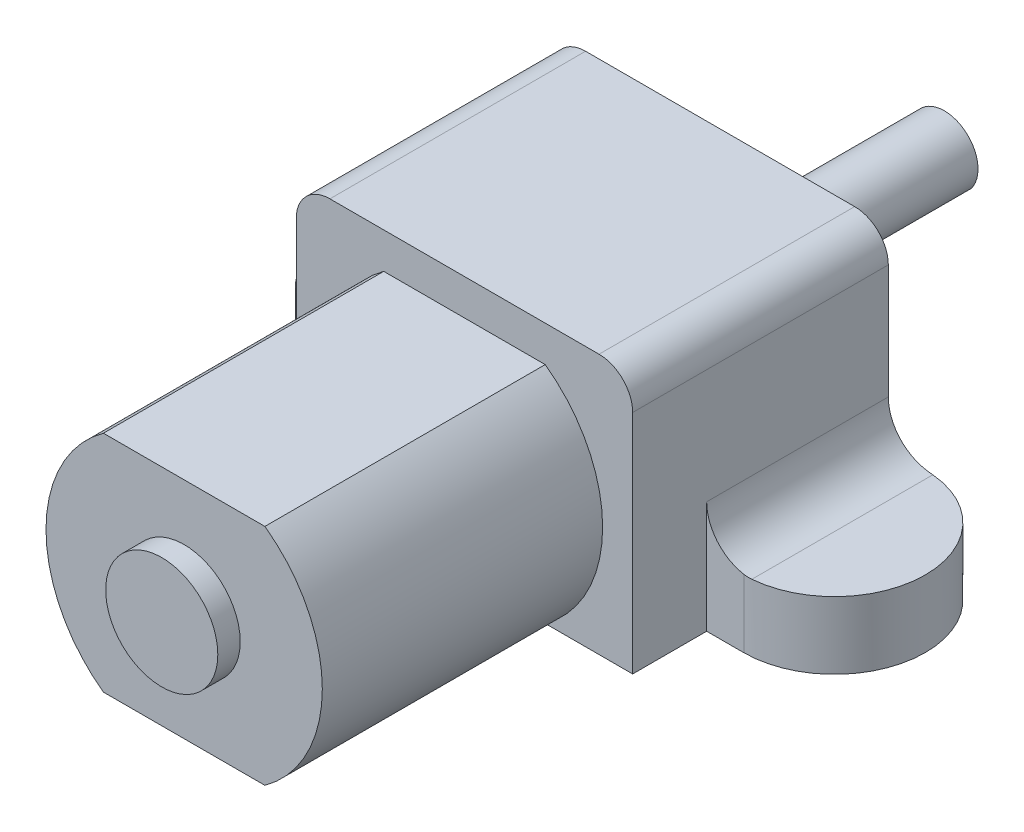
ISO-10303-21;
HEADER;
FILE_DESCRIPTION(('STEP AP214'),'2;1');
FILE_NAME('part.step','',(''),(''),'','','');
FILE_SCHEMA(('AUTOMOTIVE_DESIGN { 1 0 10303 214 1 1 1 1 }'));
ENDSEC;
DATA;
#1=APPLICATION_CONTEXT('core data for automotive mechanical design processes');
#2=APPLICATION_PROTOCOL_DEFINITION('international standard','automotive_design',2000,#1);
#3=PRODUCT_CONTEXT('',#1,'mechanical');
#4=PRODUCT('Part','Part','',(#3));
#5=PRODUCT_RELATED_PRODUCT_CATEGORY('part','',(#4));
#6=PRODUCT_DEFINITION_FORMATION('','',#4);
#7=PRODUCT_DEFINITION_CONTEXT('part definition',#1,'design');
#8=PRODUCT_DEFINITION('design','',#6,#7);
#9=PRODUCT_DEFINITION_SHAPE('','',#8);
#10=(LENGTH_UNIT() NAMED_UNIT(*) SI_UNIT(.MILLI.,.METRE.));
#11=(NAMED_UNIT(*) PLANE_ANGLE_UNIT() SI_UNIT($,.RADIAN.));
#12=(NAMED_UNIT(*) SI_UNIT($,.STERADIAN.) SOLID_ANGLE_UNIT());
#13=UNCERTAINTY_MEASURE_WITH_UNIT(LENGTH_MEASURE(1.E-05),#10,'distance_accuracy_value','');
#14=(GEOMETRIC_REPRESENTATION_CONTEXT(3) GLOBAL_UNCERTAINTY_ASSIGNED_CONTEXT((#13)) GLOBAL_UNIT_ASSIGNED_CONTEXT((#10,
#11,#12)) REPRESENTATION_CONTEXT('',''));
#15=CARTESIAN_POINT('',(0.,0.,0.));
#16=DIRECTION('',(0.,0.,1.));
#17=DIRECTION('',(1.,0.,0.));
#18=AXIS2_PLACEMENT_3D('',#15,#16,#17);
#19=CARTESIAN_POINT('',(0.,-0.800465861795815,23.9));
#20=DIRECTION('',(0.,0.,1.));
#21=DIRECTION('',(1.,0.,0.));
#22=AXIS2_PLACEMENT_3D('',#19,#20,#21);
#23=PLANE('',#22);
#24=CARTESIAN_POINT('',(0.,-0.800465861795815,23.9));
#25=DIRECTION('',(0.,0.,1.));
#26=DIRECTION('',(1.,0.,0.));
#27=AXIS2_PLACEMENT_3D('',#24,#25,#26);
#28=CIRCLE('',#27,6.16079066346756);
#29=CARTESIAN_POINT('',(3.6,-5.8,23.9));
#30=VERTEX_POINT('',#29);
#31=CARTESIAN_POINT('',(3.6,4.19906827640837,23.9));
#32=VERTEX_POINT('',#31);
#33=EDGE_CURVE('E399',#30,#32,#28,.T.);
#34=ORIENTED_EDGE('',*,*,#33,.T.);
#35=DIRECTION('',(-1.,0.,0.));
#36=VECTOR('',#35,1.);
#37=CARTESIAN_POINT('',(-3.6,4.19906827640837,23.9));
#38=LINE('',#37,#36);
#39=CARTESIAN_POINT('',(-3.6,4.19906827640837,23.9));
#40=VERTEX_POINT('',#39);
#41=EDGE_CURVE('E402',#32,#40,#38,.T.);
#42=ORIENTED_EDGE('',*,*,#41,.T.);
#43=CARTESIAN_POINT('',(0.,-0.800465861795815,23.9));
#44=DIRECTION('',(0.,0.,1.));
#45=DIRECTION('',(1.,0.,0.));
#46=AXIS2_PLACEMENT_3D('',#43,#44,#45);
#47=CIRCLE('',#46,6.16079066346756);
#48=CARTESIAN_POINT('',(-3.6,-5.8,23.9));
#49=VERTEX_POINT('',#48);
#50=EDGE_CURVE('E405',#40,#49,#47,.T.);
#51=ORIENTED_EDGE('',*,*,#50,.T.);
#52=DIRECTION('',(1.,0.,0.));
#53=VECTOR('',#52,1.);
#54=CARTESIAN_POINT('',(-3.6,-5.8,23.9));
#55=LINE('',#54,#53);
#56=EDGE_CURVE('E407',#49,#30,#55,.T.);
#57=ORIENTED_EDGE('',*,*,#56,.T.);
#58=EDGE_LOOP('',(#34,#42,#51,#57));
#59=FACE_BOUND('',#58,.T.);
#60=CARTESIAN_POINT('',(0.,-0.800465861795815,23.9));
#61=DIRECTION('',(0.,0.,1.));
#62=DIRECTION('',(1.,0.,0.));
#63=AXIS2_PLACEMENT_3D('',#60,#61,#62);
#64=CIRCLE('',#63,2.5);
#65=CARTESIAN_POINT('',(2.5,-0.800465861795815,23.9));
#66=VERTEX_POINT('',#65);
#67=EDGE_CURVE('E452',#66,#66,#64,.T.);
#68=ORIENTED_EDGE('',*,*,#67,.F.);
#69=EDGE_LOOP('',(#68));
#70=FACE_BOUND('',#69,.T.);
#71=ADVANCED_FACE('F36',(#59,#70),#23,.T.);
#72=CARTESIAN_POINT('',(9.5,-0.799999999999999,8.1));
#73=DIRECTION('',(0.,0.,-1.));
#74=DIRECTION('',(0.,1.,0.));
#75=AXIS2_PLACEMENT_3D('',#72,#73,#74);
#76=CYLINDRICAL_SURFACE('',#75,2.);
#77=CARTESIAN_POINT('',(9.5,-2.8,0.0150974913643064));
#78=CARTESIAN_POINT('',(9.44815312771048,-2.80000824449643,0.0105907373298993));
#79=CARTESIAN_POINT('',(9.39621865764928,-2.79798395132537,0.00710049425139584));
#80=CARTESIAN_POINT('',(9.29295128964275,-2.78992088042198,0.00214096238895021));
#81=CARTESIAN_POINT('',(9.2416167789262,-2.78391179682455,0.000656970002410962));
#82=CARTESIAN_POINT('',(9.13955148697663,-2.76792920261616,-0.000367540570609882));
#83=CARTESIAN_POINT('',(9.08882069263783,-2.75795577822741,9.18989764465253E-05));
#84=CARTESIAN_POINT('',(8.98795499809073,-2.73404333928579,0.00286277611937516));
#85=CARTESIAN_POINT('',(8.93782731834473,-2.72007543253437,0.00518793827901116));
#86=CARTESIAN_POINT('',(8.88837861318026,-2.70418467570367,0.00839574563265417));
#87=B_SPLINE_CURVE_WITH_KNOTS('',3,(#77,#78,#79,#80,#81,#82,#83,#84,#85,#86),.UNSPECIFIED.,.F.,
.F.,(4,2,2,2,4),(0.,0.156076682454964,0.31100317892682,0.465926306018408,0.621999637199964),.UNSPECIFIED.);
#88=CARTESIAN_POINT('',(9.17184315486788,-2.77289459551009,0.));
#89=VERTEX_POINT('',#88);
#90=CARTESIAN_POINT('',(9.5,-2.8,0.0150974913643064));
#91=VERTEX_POINT('',#90);
#92=EDGE_CURVE('E494',#89,#91,#87,.F.);
#93=ORIENTED_EDGE('',*,*,#92,.F.);
#94=CARTESIAN_POINT('',(9.5,-0.799999999999998,0.));
#95=DIRECTION('',(0.,0.,-1.));
#96=DIRECTION('',(-1.,0.,0.));
#97=AXIS2_PLACEMENT_3D('',#94,#95,#96);
#98=CIRCLE('',#97,2.);
#99=CARTESIAN_POINT('',(7.5,-0.799999999999998,0.));
#100=VERTEX_POINT('',#99);
#101=EDGE_CURVE('E45',#89,#100,#98,.T.);
#102=ORIENTED_EDGE('',*,*,#101,.T.);
#103=DIRECTION('',(0.,0.,1.));
#104=VECTOR('',#103,1.);
#105=CARTESIAN_POINT('',(7.5,-0.799999999999999,8.1));
#106=LINE('',#105,#104);
#107=CARTESIAN_POINT('',(7.5,-0.799999999999999,8.1));
#108=VERTEX_POINT('',#107);
#109=EDGE_CURVE('E489',#108,#100,#106,.F.);
#110=ORIENTED_EDGE('',*,*,#109,.F.);
#111=CARTESIAN_POINT('',(9.5,-0.799999999999999,8.1));
#112=DIRECTION('',(0.,0.,-1.));
#113=DIRECTION('',(-1.,0.,0.));
#114=AXIS2_PLACEMENT_3D('',#111,#112,#113);
#115=CIRCLE('',#114,2.);
#116=CARTESIAN_POINT('',(9.17184315486815,-2.77289459551014,8.1));
#117=VERTEX_POINT('',#116);
#118=EDGE_CURVE('E12',#108,#117,#115,.F.);
#119=ORIENTED_EDGE('',*,*,#118,.T.);
#120=CARTESIAN_POINT('',(9.5,-2.8,8.08490250863569));
#121=CARTESIAN_POINT('',(9.44815312771048,-2.80000824449643,8.0894092626701));
#122=CARTESIAN_POINT('',(9.39621865764928,-2.79798395132537,8.0928995057486));
#123=CARTESIAN_POINT('',(9.29295128964275,-2.78992088042198,8.09785903761105));
#124=CARTESIAN_POINT('',(9.2416167789262,-2.78391179682455,8.09934302999759));
#125=CARTESIAN_POINT('',(9.13955148697663,-2.76792920261617,8.10036754057061));
#126=CARTESIAN_POINT('',(9.08882069263783,-2.75795577822741,8.09990810102355));
#127=CARTESIAN_POINT('',(8.98795499809073,-2.73404333928579,8.09713722388063));
#128=CARTESIAN_POINT('',(8.93782731834473,-2.72007543253437,8.09481206172099));
#129=CARTESIAN_POINT('',(8.88837861318026,-2.70418467570367,8.09160425436735));
#130=B_SPLINE_CURVE_WITH_KNOTS('',3,(#120,#121,#122,#123,#124,#125,#126,#127,#128,#129),
.UNSPECIFIED.,.F.,.F.,(4,2,2,2,4),(0.,0.156076682454964,0.31100317892682,0.465926306018408,
0.621999637199965),.UNSPECIFIED.);
#131=CARTESIAN_POINT('',(9.5,-2.8,8.08490250863569));
#132=VERTEX_POINT('',#131);
#133=EDGE_CURVE('E500',#132,#117,#130,.T.);
#134=ORIENTED_EDGE('',*,*,#133,.F.);
#135=DIRECTION('',(0.,0.,1.));
#136=VECTOR('',#135,1.);
#137=CARTESIAN_POINT('',(9.5,-2.8,8.1));
#138=LINE('',#137,#136);
#139=EDGE_CURVE('E486',#91,#132,#138,.T.);
#140=ORIENTED_EDGE('',*,*,#139,.F.);
#141=EDGE_LOOP('',(#93,#102,#110,#119,#134,#140));
#142=FACE_BOUND('',#141,.T.);
#143=ADVANCED_FACE('F38',(#142),#76,.F.);
#144=CARTESIAN_POINT('',(-7.5,-5.8,11.4));
#145=DIRECTION('',(0.,1.,0.));
#146=DIRECTION('',(0.,0.,1.));
#147=AXIS2_PLACEMENT_3D('',#144,#145,#146);
#148=PLANE('',#147);
#149=DIRECTION('',(1.,0.,0.));
#150=VECTOR('',#149,1.);
#151=CARTESIAN_POINT('',(-7.5,-5.8,0.));
#152=LINE('',#151,#150);
#153=CARTESIAN_POINT('',(-9.14356009032005,-5.8,0.));
#154=VERTEX_POINT('',#153);
#155=CARTESIAN_POINT('',(9.17184315486785,-5.8,0.));
#156=VERTEX_POINT('',#155);
#157=EDGE_CURVE('E194',#154,#156,#152,.T.);
#158=ORIENTED_EDGE('',*,*,#157,.T.);
#159=CARTESIAN_POINT('',(9.14994077646019,-5.8,4.05));
#160=DIRECTION('',(0.,1.,0.));
#161=DIRECTION('',(0.,0.,1.));
#162=AXIS2_PLACEMENT_3D('',#159,#160,#161);
#163=CIRCLE('',#162,4.05005922353981);
#164=CARTESIAN_POINT('',(9.17184315486829,-5.8,8.1));
#165=VERTEX_POINT('',#164);
#166=EDGE_CURVE('E184',#156,#165,#163,.F.);
#167=ORIENTED_EDGE('',*,*,#166,.T.);
#168=DIRECTION('',(-1.,0.,0.));
#169=VECTOR('',#168,1.);
#170=CARTESIAN_POINT('',(13.2,-5.8,8.1));
#171=LINE('',#170,#169);
#172=CARTESIAN_POINT('',(7.5,-5.8,8.1));
#173=VERTEX_POINT('',#172);
#174=EDGE_CURVE('E463',#165,#173,#171,.T.);
#175=ORIENTED_EDGE('',*,*,#174,.T.);
#176=DIRECTION('',(0.,0.,-1.));
#177=VECTOR('',#176,1.);
#178=CARTESIAN_POINT('',(7.5,-5.8,11.4));
#179=LINE('',#178,#177);
#180=CARTESIAN_POINT('',(7.5,-5.8,11.4));
#181=VERTEX_POINT('',#180);
#182=EDGE_CURVE('E215',#181,#173,#179,.T.);
#183=ORIENTED_EDGE('',*,*,#182,.F.);
#184=DIRECTION('',(1.,0.,0.));
#185=VECTOR('',#184,1.);
#186=CARTESIAN_POINT('',(-7.5,-5.8,11.4));
#187=LINE('',#186,#185);
#188=CARTESIAN_POINT('',(3.6,-5.8,11.4));
#189=VERTEX_POINT('',#188);
#190=EDGE_CURVE('E225',#189,#181,#187,.T.);
#191=ORIENTED_EDGE('',*,*,#190,.F.);
#192=DIRECTION('',(0.,0.,-1.));
#193=VECTOR('',#192,1.);
#194=CARTESIAN_POINT('',(3.6,-5.8,23.9));
#195=LINE('',#194,#193);
#196=EDGE_CURVE('E409',#30,#189,#195,.T.);
#197=ORIENTED_EDGE('',*,*,#196,.F.);
#198=ORIENTED_EDGE('',*,*,#56,.F.);
#199=DIRECTION('',(0.,0.,-1.));
#200=VECTOR('',#199,1.);
#201=CARTESIAN_POINT('',(-3.6,-5.8,23.9));
#202=LINE('',#201,#200);
#203=CARTESIAN_POINT('',(-3.6,-5.8,11.4));
#204=VERTEX_POINT('',#203);
#205=EDGE_CURVE('E423',#49,#204,#202,.T.);
#206=ORIENTED_EDGE('',*,*,#205,.T.);
#207=CARTESIAN_POINT('',(-7.5,-5.8,11.4));
#208=VERTEX_POINT('',#207);
#209=EDGE_CURVE('E219',#208,#204,#187,.T.);
#210=ORIENTED_EDGE('',*,*,#209,.F.);
#211=DIRECTION('',(0.,0.,-1.));
#212=VECTOR('',#211,1.);
#213=CARTESIAN_POINT('',(-7.5,-5.8,11.4));
#214=LINE('',#213,#212);
#215=CARTESIAN_POINT('',(-7.5,-5.8,8.1));
#216=VERTEX_POINT('',#215);
#217=EDGE_CURVE('E218',#208,#216,#214,.T.);
#218=ORIENTED_EDGE('',*,*,#217,.T.);
#219=DIRECTION('',(1.,0.,0.));
#220=VECTOR('',#219,1.);
#221=CARTESIAN_POINT('',(-13.2,-5.8,8.1));
#222=LINE('',#221,#220);
#223=CARTESIAN_POINT('',(-9.46668465095968,-5.8,8.1));
#224=VERTEX_POINT('',#223);
#225=EDGE_CURVE('E376',#224,#216,#222,.T.);
#226=ORIENTED_EDGE('',*,*,#225,.F.);
#227=CARTESIAN_POINT('',(-9.14356009032005,-5.8,4.05644502973386));
#228=DIRECTION('',(0.,1.,0.));
#229=DIRECTION('',(0.,0.,1.));
#230=AXIS2_PLACEMENT_3D('',#227,#228,#229);
#231=CIRCLE('',#230,4.05644502973386);
#232=CARTESIAN_POINT('',(-13.2,-5.8,4.05644502973386));
#233=VERTEX_POINT('',#232);
#234=EDGE_CURVE('E373',#233,#224,#231,.T.);
#235=ORIENTED_EDGE('',*,*,#234,.F.);
#236=DIRECTION('',(0.,0.,1.));
#237=VECTOR('',#236,1.);
#238=CARTESIAN_POINT('',(-13.2,-5.8,8.1));
#239=LINE('',#238,#237);
#240=CARTESIAN_POINT('',(-13.2,-5.8,4.05));
#241=VERTEX_POINT('',#240);
#242=EDGE_CURVE('E364',#241,#233,#239,.T.);
#243=ORIENTED_EDGE('',*,*,#242,.F.);
#244=CARTESIAN_POINT('',(-9.14356009032005,-5.8,4.05644502973386));
#245=DIRECTION('',(0.,1.,0.));
#246=DIRECTION('',(0.,0.,1.));
#247=AXIS2_PLACEMENT_3D('',#244,#245,#246);
#248=CIRCLE('',#247,4.05644502973386);
#249=EDGE_CURVE('E203',#154,#241,#248,.T.);
#250=ORIENTED_EDGE('',*,*,#249,.F.);
#251=EDGE_LOOP('',(#158,#167,#175,#183,#191,#197,#198,#206,#210,#218,#226,#235,#243,#250));
#252=FACE_BOUND('',#251,.T.);
#253=ADVANCED_FACE('F201',(#252),#148,.F.);
#254=CARTESIAN_POINT('',(0.,0.,0.));
#255=DIRECTION('',(0.,0.,-1.));
#256=DIRECTION('',(-1.,0.,0.));
#257=AXIS2_PLACEMENT_3D('',#254,#255,#256);
#258=PLANE('',#257);
#259=DIRECTION('',(-1.,0.,0.));
#260=VECTOR('',#259,1.);
#261=CARTESIAN_POINT('',(1.2,-0.9,0.));
#262=LINE('',#261,#260);
#263=CARTESIAN_POINT('',(1.2,-0.9,0.));
#264=VERTEX_POINT('',#263);
#265=CARTESIAN_POINT('',(-1.2,-0.9,0.));
#266=VERTEX_POINT('',#265);
#267=EDGE_CURVE('E388',#264,#266,#262,.T.);
#268=ORIENTED_EDGE('',*,*,#267,.F.);
#269=CARTESIAN_POINT('',(0.,0.,0.));
#270=DIRECTION('',(0.,0.,-1.));
#271=DIRECTION('',(-1.,0.,0.));
#272=AXIS2_PLACEMENT_3D('',#269,#270,#271);
#273=CIRCLE('',#272,1.5);
#274=EDGE_CURVE('E383',#266,#264,#273,.T.);
#275=ORIENTED_EDGE('',*,*,#274,.F.);
#276=EDGE_LOOP('',(#268,#275));
#277=FACE_BOUND('',#276,.T.);
#278=ORIENTED_EDGE('',*,*,#101,.F.);
#279=DIRECTION('',(0.,1.,0.));
#280=VECTOR('',#279,1.);
#281=CARTESIAN_POINT('',(9.17184315486785,-8.5,0.));
#282=LINE('',#281,#280);
#283=EDGE_CURVE('E59',#156,#89,#282,.T.);
#284=ORIENTED_EDGE('',*,*,#283,.F.);
#285=ORIENTED_EDGE('',*,*,#157,.F.);
#286=DIRECTION('',(0.,1.,0.));
#287=VECTOR('',#286,1.);
#288=CARTESIAN_POINT('',(-9.14356009032005,-12.8,0.));
#289=LINE('',#288,#287);
#290=CARTESIAN_POINT('',(-9.14356009032005,-2.76798134919703,0.));
#291=VERTEX_POINT('',#290);
#292=EDGE_CURVE('E466',#154,#291,#289,.T.);
#293=ORIENTED_EDGE('',*,*,#292,.T.);
#294=CARTESIAN_POINT('',(-9.5,-0.799999999999999,0.));
#295=DIRECTION('',(0.,0.,-1.));
#296=DIRECTION('',(-1.,0.,0.));
#297=AXIS2_PLACEMENT_3D('',#294,#295,#296);
#298=CIRCLE('',#297,2.);
#299=CARTESIAN_POINT('',(-7.5,-0.799999999999999,0.));
#300=VERTEX_POINT('',#299);
#301=EDGE_CURVE('E481',#300,#291,#298,.T.);
#302=ORIENTED_EDGE('',*,*,#301,.F.);
#303=DIRECTION('',(0.,-1.,0.));
#304=VECTOR('',#303,1.);
#305=CARTESIAN_POINT('',(-7.5,-5.8,0.));
#306=LINE('',#305,#304);
#307=CARTESIAN_POINT('',(-7.5,4.3,0.));
#308=VERTEX_POINT('',#307);
#309=EDGE_CURVE('E205',#308,#300,#306,.T.);
#310=ORIENTED_EDGE('',*,*,#309,.F.);
#311=CARTESIAN_POINT('',(-6.,4.3,0.));
#312=DIRECTION('',(0.,0.,-1.));
#313=DIRECTION('',(-1.,0.,0.));
#314=AXIS2_PLACEMENT_3D('',#311,#312,#313);
#315=CIRCLE('',#314,1.5);
#316=CARTESIAN_POINT('',(-6.,5.8,0.));
#317=VERTEX_POINT('',#316);
#318=EDGE_CURVE('E251',#308,#317,#315,.T.);
#319=ORIENTED_EDGE('',*,*,#318,.T.);
#320=DIRECTION('',(-1.,0.,0.));
#321=VECTOR('',#320,1.);
#322=CARTESIAN_POINT('',(-7.5,5.8,0.));
#323=LINE('',#322,#321);
#324=CARTESIAN_POINT('',(6.,5.8,0.));
#325=VERTEX_POINT('',#324);
#326=EDGE_CURVE('E211',#325,#317,#323,.T.);
#327=ORIENTED_EDGE('',*,*,#326,.F.);
#328=CARTESIAN_POINT('',(6.,4.3,0.));
#329=DIRECTION('',(0.,0.,-1.));
#330=DIRECTION('',(-1.,0.,0.));
#331=AXIS2_PLACEMENT_3D('',#328,#329,#330);
#332=CIRCLE('',#331,1.5);
#333=CARTESIAN_POINT('',(7.5,4.3,0.));
#334=VERTEX_POINT('',#333);
#335=EDGE_CURVE('E248',#325,#334,#332,.T.);
#336=ORIENTED_EDGE('',*,*,#335,.T.);
#337=DIRECTION('',(0.,1.,0.));
#338=VECTOR('',#337,1.);
#339=CARTESIAN_POINT('',(7.5,-5.8,0.));
#340=LINE('',#339,#338);
#341=EDGE_CURVE('E232',#100,#334,#340,.T.);
#342=ORIENTED_EDGE('',*,*,#341,.F.);
#343=EDGE_LOOP('',(#278,#284,#285,#293,#302,#310,#319,#327,#336,#342));
#344=FACE_BOUND('',#343,.T.);
#345=ADVANCED_FACE('F193',(#277,#344),#258,.T.);
#346=CARTESIAN_POINT('',(13.2,-2.8,8.1));
#347=DIRECTION('',(0.,-1.,0.));
#348=DIRECTION('',(0.,0.,-1.));
#349=AXIS2_PLACEMENT_3D('',#346,#347,#348);
#350=PLANE('',#349);
#351=CARTESIAN_POINT('',(9.14994077646019,-2.8,4.05));
#352=DIRECTION('',(0.,1.,0.));
#353=DIRECTION('',(0.,0.,1.));
#354=AXIS2_PLACEMENT_3D('',#351,#352,#353);
#355=CIRCLE('',#354,4.05005922353981);
#356=EDGE_CURVE('E197',#91,#132,#355,.F.);
#357=ORIENTED_EDGE('',*,*,#356,.F.);
#358=ORIENTED_EDGE('',*,*,#139,.T.);
#359=EDGE_LOOP('',(#357,#358));
#360=FACE_BOUND('',#359,.T.);
#361=ADVANCED_FACE('F308',(#360),#350,.F.);
#362=CARTESIAN_POINT('',(7.5,-5.8,11.4));
#363=DIRECTION('',(-1.,0.,0.));
#364=DIRECTION('',(0.,0.,1.));
#365=AXIS2_PLACEMENT_3D('',#362,#363,#364);
#366=PLANE('',#365);
#367=DIRECTION('',(0.,-1.,0.));
#368=VECTOR('',#367,1.);
#369=CARTESIAN_POINT('',(7.5,-5.8,8.1));
#370=LINE('',#369,#368);
#371=EDGE_CURVE('E189',#108,#173,#370,.T.);
#372=ORIENTED_EDGE('',*,*,#371,.F.);
#373=ORIENTED_EDGE('',*,*,#109,.T.);
#374=ORIENTED_EDGE('',*,*,#341,.T.);
#375=DIRECTION('',(0.,0.,1.));
#376=VECTOR('',#375,1.);
#377=CARTESIAN_POINT('',(7.5,4.3,11.4));
#378=LINE('',#377,#376);
#379=CARTESIAN_POINT('',(7.5,4.3,11.4));
#380=VERTEX_POINT('',#379);
#381=EDGE_CURVE('E222',#334,#380,#378,.T.);
#382=ORIENTED_EDGE('',*,*,#381,.T.);
#383=DIRECTION('',(0.,1.,0.));
#384=VECTOR('',#383,1.);
#385=CARTESIAN_POINT('',(7.5,-5.8,11.4));
#386=LINE('',#385,#384);
#387=EDGE_CURVE('E204',#181,#380,#386,.T.);
#388=ORIENTED_EDGE('',*,*,#387,.F.);
#389=ORIENTED_EDGE('',*,*,#182,.T.);
#390=EDGE_LOOP('',(#372,#373,#374,#382,#388,#389));
#391=FACE_BOUND('',#390,.T.);
#392=ADVANCED_FACE('F295',(#391),#366,.F.);
#393=CARTESIAN_POINT('',(-9.5,-0.799999999999999,0.));
#394=DIRECTION('',(0.,0.,1.));
#395=DIRECTION('',(1.,0.,0.));
#396=AXIS2_PLACEMENT_3D('',#393,#394,#395);
#397=CYLINDRICAL_SURFACE('',#396,2.);
#398=CARTESIAN_POINT('',(-9.5,-2.8,8.09719952240474));
#399=CARTESIAN_POINT('',(-9.44815856687958,-2.8000082334596,8.10178113958432));
#400=CARTESIAN_POINT('',(-9.39622814670322,-2.79798437227438,8.10534793646262));
#401=CARTESIAN_POINT('',(-9.29296579476972,-2.78992232953518,8.11046272065454));
#402=CARTESIAN_POINT('',(-9.24163227225051,-2.78391382885766,8.1120253857615));
#403=CARTESIAN_POINT('',(-9.13956593523447,-2.76793185911742,8.11320924490378));
#404=CARTESIAN_POINT('',(-9.08883310804294,-2.75795847400042,8.11283048004162));
#405=CARTESIAN_POINT('',(-8.98796073204633,-2.73404494869054,8.11022285214277));
#406=CARTESIAN_POINT('',(-8.9378283803315,-2.72007591917397,8.10798027976786));
#407=CARTESIAN_POINT('',(-8.88837373439782,-2.70418310863886,8.10485536009857));
#408=B_SPLINE_CURVE_WITH_KNOTS('',3,(#398,#399,#400,#401,#402,#403,#404,#405,#406,#407),
.UNSPECIFIED.,.F.,.F.,(4,2,2,2,4),(0.,0.156080174659477,0.311010601694024,0.465937748669463,
0.622014661972067),.UNSPECIFIED.);
#409=CARTESIAN_POINT('',(-9.46668465095967,-2.79972250262838,8.1));
#410=VERTEX_POINT('',#409);
#411=CARTESIAN_POINT('',(-9.5,-2.8,8.09719952240474));
#412=VERTEX_POINT('',#411);
#413=EDGE_CURVE('E275',#410,#412,#408,.F.);
#414=ORIENTED_EDGE('',*,*,#413,.F.);
#415=CARTESIAN_POINT('',(-9.5,-0.799999999999999,8.1));
#416=DIRECTION('',(0.,0.,-1.));
#417=DIRECTION('',(-1.,0.,0.));
#418=AXIS2_PLACEMENT_3D('',#415,#416,#417);
#419=CIRCLE('',#418,2.);
#420=CARTESIAN_POINT('',(-7.5,-0.799999999999999,8.1));
#421=VERTEX_POINT('',#420);
#422=EDGE_CURVE('E478',#410,#421,#419,.F.);
#423=ORIENTED_EDGE('',*,*,#422,.T.);
#424=DIRECTION('',(0.,0.,-1.));
#425=VECTOR('',#424,1.);
#426=CARTESIAN_POINT('',(-7.5,-0.799999999999999,0.));
#427=LINE('',#426,#425);
#428=EDGE_CURVE('E272',#300,#421,#427,.F.);
#429=ORIENTED_EDGE('',*,*,#428,.F.);
#430=ORIENTED_EDGE('',*,*,#301,.T.);
#431=CARTESIAN_POINT('',(-9.50000000000175,-2.8,0.0156905370631384));
#432=CARTESIAN_POINT('',(-9.44815856688134,-2.80000823345964,0.0111089198835416));
#433=CARTESIAN_POINT('',(-9.39622814670498,-2.79798437227448,0.00754212300521932));
#434=CARTESIAN_POINT('',(-9.2929657947715,-2.78992232953537,0.00242733881325361));
#435=CARTESIAN_POINT('',(-9.24163227225229,-2.7839138288579,0.000864673706265339));
#436=CARTESIAN_POINT('',(-9.13956593523625,-2.76793185911774,-0.000319185436060288));
#437=CARTESIAN_POINT('',(-9.08883310804472,-2.7579584740008,5.95794260799452E-05));
#438=CARTESIAN_POINT('',(-8.9879607320481,-2.73404494869101,0.0026672073248851));
#439=CARTESIAN_POINT('',(-8.93782838033326,-2.72007591917448,0.0049097796997716));
#440=CARTESIAN_POINT('',(-8.88837373439958,-2.70418310863942,0.00803469936904486));
#441=B_SPLINE_CURVE_WITH_KNOTS('',3,(#431,#432,#433,#434,#435,#436,#437,#438,#439,#440),
.UNSPECIFIED.,.F.,.F.,(4,2,2,2,4),(0.,0.156080174659457,0.311010601693983,0.465937748669403,
0.622014661971984),.UNSPECIFIED.);
#442=CARTESIAN_POINT('',(-9.50000000000175,-2.8,0.0156905370631384));
#443=VERTEX_POINT('',#442);
#444=EDGE_CURVE('E281',#443,#291,#441,.T.);
#445=ORIENTED_EDGE('',*,*,#444,.F.);
#446=DIRECTION('',(0.,0.,-1.));
#447=VECTOR('',#446,1.);
#448=CARTESIAN_POINT('',(-9.5,-2.8,0.));
#449=LINE('',#448,#447);
#450=EDGE_CURVE('E269',#412,#443,#449,.T.);
#451=ORIENTED_EDGE('',*,*,#450,.F.);
#452=EDGE_LOOP('',(#414,#423,#429,#430,#445,#451));
#453=FACE_BOUND('',#452,.T.);
#454=ADVANCED_FACE('F290',(#453),#397,.F.);
#455=CARTESIAN_POINT('',(-13.2,-2.8,0.));
#456=DIRECTION('',(0.,-1.,0.));
#457=DIRECTION('',(0.,0.,-1.));
#458=AXIS2_PLACEMENT_3D('',#455,#456,#457);
#459=PLANE('',#458);
#460=CARTESIAN_POINT('',(-9.14356009032005,-2.8,4.05644502973386));
#461=DIRECTION('',(0.,1.,0.));
#462=DIRECTION('',(0.,0.,1.));
#463=AXIS2_PLACEMENT_3D('',#460,#461,#462);
#464=CIRCLE('',#463,4.05644502973386);
#465=CARTESIAN_POINT('',(-13.2,-2.8,4.05644502973386));
#466=VERTEX_POINT('',#465);
#467=EDGE_CURVE('E470',#466,#412,#464,.T.);
#468=ORIENTED_EDGE('',*,*,#467,.T.);
#469=ORIENTED_EDGE('',*,*,#450,.T.);
#470=CARTESIAN_POINT('',(-9.14356009032005,-2.8,4.05644502973386));
#471=DIRECTION('',(0.,1.,0.));
#472=DIRECTION('',(0.,0.,1.));
#473=AXIS2_PLACEMENT_3D('',#470,#471,#472);
#474=CIRCLE('',#473,4.05644502973386);
#475=CARTESIAN_POINT('',(-13.2,-2.8,4.05));
#476=VERTEX_POINT('',#475);
#477=EDGE_CURVE('E465',#443,#476,#474,.T.);
#478=ORIENTED_EDGE('',*,*,#477,.T.);
#479=DIRECTION('',(0.,0.,-1.));
#480=VECTOR('',#479,1.);
#481=CARTESIAN_POINT('',(-13.2,-2.8,0.));
#482=LINE('',#481,#480);
#483=EDGE_CURVE('E367',#466,#476,#482,.T.);
#484=ORIENTED_EDGE('',*,*,#483,.F.);
#485=EDGE_LOOP('',(#468,#469,#478,#484));
#486=FACE_BOUND('',#485,.T.);
#487=ADVANCED_FACE('F294',(#486),#459,.F.);
#488=CARTESIAN_POINT('',(-13.2,0.,0.));
#489=DIRECTION('',(1.,0.,0.));
#490=DIRECTION('',(0.,0.,-1.));
#491=AXIS2_PLACEMENT_3D('',#488,#489,#490);
#492=PLANE('',#491);
#493=DIRECTION('',(0.,1.,0.));
#494=VECTOR('',#493,1.);
#495=CARTESIAN_POINT('',(-13.2,-12.8,4.05));
#496=LINE('',#495,#494);
#497=EDGE_CURVE('E268',#241,#476,#496,.T.);
#498=ORIENTED_EDGE('',*,*,#497,.F.);
#499=ORIENTED_EDGE('',*,*,#242,.T.);
#500=DIRECTION('',(0.,1.,0.));
#501=VECTOR('',#500,1.);
#502=CARTESIAN_POINT('',(-13.200002560027,-12.8,4.05644502973386));
#503=LINE('',#502,#501);
#504=EDGE_CURVE('E255',#233,#466,#503,.T.);
#505=ORIENTED_EDGE('',*,*,#504,.T.);
#506=ORIENTED_EDGE('',*,*,#483,.T.);
#507=EDGE_LOOP('',(#498,#499,#505,#506));
#508=FACE_BOUND('',#507,.T.);
#509=ADVANCED_FACE('F353',(#508),#492,.F.);
#510=CARTESIAN_POINT('',(-13.2,-2.8,8.1));
#511=DIRECTION('',(0.,0.,-1.));
#512=DIRECTION('',(-1.,0.,0.));
#513=AXIS2_PLACEMENT_3D('',#510,#511,#512);
#514=PLANE('',#513);
#515=DIRECTION('',(0.,1.,0.));
#516=VECTOR('',#515,1.);
#517=CARTESIAN_POINT('',(-9.46668465095968,-12.8,8.1));
#518=LINE('',#517,#516);
#519=EDGE_CURVE('E472',#224,#410,#518,.T.);
#520=ORIENTED_EDGE('',*,*,#519,.F.);
#521=ORIENTED_EDGE('',*,*,#225,.T.);
#522=DIRECTION('',(0.,1.,0.));
#523=VECTOR('',#522,1.);
#524=CARTESIAN_POINT('',(-7.5,-2.8,8.1));
#525=LINE('',#524,#523);
#526=EDGE_CURVE('E374',#216,#421,#525,.T.);
#527=ORIENTED_EDGE('',*,*,#526,.T.);
#528=ORIENTED_EDGE('',*,*,#422,.F.);
#529=EDGE_LOOP('',(#520,#521,#527,#528));
#530=FACE_BOUND('',#529,.T.);
#531=ADVANCED_FACE('F315',(#530),#514,.F.);
#532=CARTESIAN_POINT('',(-7.5,-5.8,11.4));
#533=DIRECTION('',(1.,0.,0.));
#534=DIRECTION('',(0.,0.,-1.));
#535=AXIS2_PLACEMENT_3D('',#532,#533,#534);
#536=PLANE('',#535);
#537=ORIENTED_EDGE('',*,*,#309,.T.);
#538=ORIENTED_EDGE('',*,*,#428,.T.);
#539=ORIENTED_EDGE('',*,*,#526,.F.);
#540=ORIENTED_EDGE('',*,*,#217,.F.);
#541=DIRECTION('',(0.,-1.,0.));
#542=VECTOR('',#541,1.);
#543=CARTESIAN_POINT('',(-7.5,-5.8,11.4));
#544=LINE('',#543,#542);
#545=CARTESIAN_POINT('',(-7.5,4.3,11.4));
#546=VERTEX_POINT('',#545);
#547=EDGE_CURVE('E230',#546,#208,#544,.T.);
#548=ORIENTED_EDGE('',*,*,#547,.F.);
#549=DIRECTION('',(0.,0.,-1.));
#550=VECTOR('',#549,1.);
#551=CARTESIAN_POINT('',(-7.5,4.3,11.4));
#552=LINE('',#551,#550);
#553=EDGE_CURVE('E259',#546,#308,#552,.T.);
#554=ORIENTED_EDGE('',*,*,#553,.T.);
#555=EDGE_LOOP('',(#537,#538,#539,#540,#548,#554));
#556=FACE_BOUND('',#555,.T.);
#557=ADVANCED_FACE('F301',(#556),#536,.F.);
#558=CARTESIAN_POINT('',(-6.,4.3,11.4));
#559=DIRECTION('',(0.,0.,-1.));
#560=DIRECTION('',(-1.,0.,0.));
#561=AXIS2_PLACEMENT_3D('',#558,#559,#560);
#562=CYLINDRICAL_SURFACE('',#561,1.5);
#563=ORIENTED_EDGE('',*,*,#553,.F.);
#564=CARTESIAN_POINT('',(-6.,4.3,11.4));
#565=DIRECTION('',(0.,0.,-1.));
#566=DIRECTION('',(-1.,0.,0.));
#567=AXIS2_PLACEMENT_3D('',#564,#565,#566);
#568=CIRCLE('',#567,1.5);
#569=CARTESIAN_POINT('',(-6.,5.8,11.4));
#570=VERTEX_POINT('',#569);
#571=EDGE_CURVE('E256',#570,#546,#568,.F.);
#572=ORIENTED_EDGE('',*,*,#571,.F.);
#573=DIRECTION('',(0.,0.,-1.));
#574=VECTOR('',#573,1.);
#575=CARTESIAN_POINT('',(-6.,5.8,11.4));
#576=LINE('',#575,#574);
#577=EDGE_CURVE('E243',#317,#570,#576,.F.);
#578=ORIENTED_EDGE('',*,*,#577,.F.);
#579=ORIENTED_EDGE('',*,*,#318,.F.);
#580=EDGE_LOOP('',(#563,#572,#578,#579));
#581=FACE_BOUND('',#580,.T.);
#582=ADVANCED_FACE('F258',(#581),#562,.T.);
#583=CARTESIAN_POINT('',(6.,4.3,11.4));
#584=DIRECTION('',(0.,0.,1.));
#585=DIRECTION('',(1.,0.,0.));
#586=AXIS2_PLACEMENT_3D('',#583,#584,#585);
#587=CYLINDRICAL_SURFACE('',#586,1.5);
#588=ORIENTED_EDGE('',*,*,#381,.F.);
#589=ORIENTED_EDGE('',*,*,#335,.F.);
#590=DIRECTION('',(0.,0.,1.));
#591=VECTOR('',#590,1.);
#592=CARTESIAN_POINT('',(6.,5.8,11.4));
#593=LINE('',#592,#591);
#594=CARTESIAN_POINT('',(6.,5.8,11.4));
#595=VERTEX_POINT('',#594);
#596=EDGE_CURVE('E246',#595,#325,#593,.F.);
#597=ORIENTED_EDGE('',*,*,#596,.F.);
#598=CARTESIAN_POINT('',(6.,4.3,11.4));
#599=DIRECTION('',(0.,0.,-1.));
#600=DIRECTION('',(-1.,0.,0.));
#601=AXIS2_PLACEMENT_3D('',#598,#599,#600);
#602=CIRCLE('',#601,1.5);
#603=EDGE_CURVE('E262',#380,#595,#602,.F.);
#604=ORIENTED_EDGE('',*,*,#603,.F.);
#605=EDGE_LOOP('',(#588,#589,#597,#604));
#606=FACE_BOUND('',#605,.T.);
#607=ADVANCED_FACE('F300',(#606),#587,.T.);
#608=CARTESIAN_POINT('',(0.,0.,11.4));
#609=DIRECTION('',(0.,0.,-1.));
#610=DIRECTION('',(-1.,0.,0.));
#611=AXIS2_PLACEMENT_3D('',#608,#609,#610);
#612=PLANE('',#611);
#613=DIRECTION('',(-1.,0.,0.));
#614=VECTOR('',#613,1.);
#615=CARTESIAN_POINT('',(-7.5,5.8,11.4));
#616=LINE('',#615,#614);
#617=EDGE_CURVE('E208',#595,#570,#616,.T.);
#618=ORIENTED_EDGE('',*,*,#617,.T.);
#619=ORIENTED_EDGE('',*,*,#571,.T.);
#620=ORIENTED_EDGE('',*,*,#547,.T.);
#621=ORIENTED_EDGE('',*,*,#209,.T.);
#622=CARTESIAN_POINT('',(0.,-0.800465861795815,11.4));
#623=DIRECTION('',(0.,0.,1.));
#624=DIRECTION('',(1.,0.,0.));
#625=AXIS2_PLACEMENT_3D('',#622,#623,#624);
#626=CIRCLE('',#625,6.16079066346756);
#627=CARTESIAN_POINT('',(-3.6,4.19906827640837,11.4));
#628=VERTEX_POINT('',#627);
#629=EDGE_CURVE('E403',#628,#204,#626,.T.);
#630=ORIENTED_EDGE('',*,*,#629,.F.);
#631=DIRECTION('',(-1.,0.,0.));
#632=VECTOR('',#631,1.);
#633=CARTESIAN_POINT('',(-3.6,4.19906827640837,11.4));
#634=LINE('',#633,#632);
#635=CARTESIAN_POINT('',(3.6,4.19906827640837,11.4));
#636=VERTEX_POINT('',#635);
#637=EDGE_CURVE('E410',#636,#628,#634,.T.);
#638=ORIENTED_EDGE('',*,*,#637,.F.);
#639=CARTESIAN_POINT('',(0.,-0.800465861795815,11.4));
#640=DIRECTION('',(0.,0.,1.));
#641=DIRECTION('',(1.,0.,0.));
#642=AXIS2_PLACEMENT_3D('',#639,#640,#641);
#643=CIRCLE('',#642,6.16079066346756);
#644=EDGE_CURVE('E398',#189,#636,#643,.T.);
#645=ORIENTED_EDGE('',*,*,#644,.F.);
#646=ORIENTED_EDGE('',*,*,#190,.T.);
#647=ORIENTED_EDGE('',*,*,#387,.T.);
#648=ORIENTED_EDGE('',*,*,#603,.T.);
#649=EDGE_LOOP('',(#618,#619,#620,#621,#630,#638,#645,#646,#647,#648));
#650=FACE_BOUND('',#649,.T.);
#651=ADVANCED_FACE('F304',(#650),#612,.F.);
#652=CARTESIAN_POINT('',(-7.5,5.8,11.4));
#653=DIRECTION('',(0.,-1.,0.));
#654=DIRECTION('',(0.,0.,-1.));
#655=AXIS2_PLACEMENT_3D('',#652,#653,#654);
#656=PLANE('',#655);
#657=ORIENTED_EDGE('',*,*,#326,.T.);
#658=ORIENTED_EDGE('',*,*,#577,.T.);
#659=ORIENTED_EDGE('',*,*,#617,.F.);
#660=ORIENTED_EDGE('',*,*,#596,.T.);
#661=EDGE_LOOP('',(#657,#658,#659,#660));
#662=FACE_BOUND('',#661,.T.);
#663=ADVANCED_FACE('F240',(#662),#656,.F.);
#664=CARTESIAN_POINT('',(0.,-0.800465861795815,23.9));
#665=DIRECTION('',(0.,0.,-1.));
#666=DIRECTION('',(-1.,0.,0.));
#667=AXIS2_PLACEMENT_3D('',#664,#665,#666);
#668=CYLINDRICAL_SURFACE('',#667,6.16079066346756);
#669=ORIENTED_EDGE('',*,*,#644,.T.);
#670=DIRECTION('',(0.,0.,-1.));
#671=VECTOR('',#670,1.);
#672=CARTESIAN_POINT('',(3.6,4.19906827640837,23.9));
#673=LINE('',#672,#671);
#674=EDGE_CURVE('E234',#32,#636,#673,.T.);
#675=ORIENTED_EDGE('',*,*,#674,.F.);
#676=ORIENTED_EDGE('',*,*,#33,.F.);
#677=ORIENTED_EDGE('',*,*,#196,.T.);
#678=EDGE_LOOP('',(#669,#675,#676,#677));
#679=FACE_BOUND('',#678,.T.);
#680=ADVANCED_FACE('F312',(#679),#668,.T.);
#681=CARTESIAN_POINT('',(-3.6,4.19906827640837,23.9));
#682=DIRECTION('',(0.,-1.,0.));
#683=DIRECTION('',(0.,0.,-1.));
#684=AXIS2_PLACEMENT_3D('',#681,#682,#683);
#685=PLANE('',#684);
#686=ORIENTED_EDGE('',*,*,#637,.T.);
#687=DIRECTION('',(0.,0.,-1.));
#688=VECTOR('',#687,1.);
#689=CARTESIAN_POINT('',(-3.6,4.19906827640837,23.9));
#690=LINE('',#689,#688);
#691=EDGE_CURVE('E415',#40,#628,#690,.T.);
#692=ORIENTED_EDGE('',*,*,#691,.F.);
#693=ORIENTED_EDGE('',*,*,#41,.F.);
#694=ORIENTED_EDGE('',*,*,#674,.T.);
#695=EDGE_LOOP('',(#686,#692,#693,#694));
#696=FACE_BOUND('',#695,.T.);
#697=ADVANCED_FACE('F327',(#696),#685,.F.);
#698=CARTESIAN_POINT('',(0.,-0.800465861795815,23.9));
#699=DIRECTION('',(0.,0.,-1.));
#700=DIRECTION('',(-1.,0.,0.));
#701=AXIS2_PLACEMENT_3D('',#698,#699,#700);
#702=CYLINDRICAL_SURFACE('',#701,6.16079066346756);
#703=ORIENTED_EDGE('',*,*,#629,.T.);
#704=ORIENTED_EDGE('',*,*,#205,.F.);
#705=ORIENTED_EDGE('',*,*,#50,.F.);
#706=ORIENTED_EDGE('',*,*,#691,.T.);
#707=EDGE_LOOP('',(#703,#704,#705,#706));
#708=FACE_BOUND('',#707,.T.);
#709=ADVANCED_FACE('F331',(#708),#702,.T.);
#710=CARTESIAN_POINT('',(0.,0.,-10.));
#711=DIRECTION('',(0.,0.,1.));
#712=DIRECTION('',(1.,0.,0.));
#713=AXIS2_PLACEMENT_3D('',#710,#711,#712);
#714=CYLINDRICAL_SURFACE('',#713,1.5);
#715=ORIENTED_EDGE('',*,*,#274,.T.);
#716=DIRECTION('',(0.,0.,1.));
#717=VECTOR('',#716,1.);
#718=CARTESIAN_POINT('',(1.2,-0.9,-10.));
#719=LINE('',#718,#717);
#720=CARTESIAN_POINT('',(1.2,-0.9,-10.));
#721=VERTEX_POINT('',#720);
#722=EDGE_CURVE('E395',#721,#264,#719,.T.);
#723=ORIENTED_EDGE('',*,*,#722,.F.);
#724=CARTESIAN_POINT('',(0.,0.,-10.));
#725=DIRECTION('',(0.,0.,-1.));
#726=DIRECTION('',(-1.,0.,0.));
#727=AXIS2_PLACEMENT_3D('',#724,#725,#726);
#728=CIRCLE('',#727,1.5);
#729=CARTESIAN_POINT('',(-1.2,-0.9,-10.));
#730=VERTEX_POINT('',#729);
#731=EDGE_CURVE('E384',#730,#721,#728,.T.);
#732=ORIENTED_EDGE('',*,*,#731,.F.);
#733=DIRECTION('',(0.,0.,1.));
#734=VECTOR('',#733,1.);
#735=CARTESIAN_POINT('',(-1.2,-0.9,-10.));
#736=LINE('',#735,#734);
#737=EDGE_CURVE('E390',#730,#266,#736,.T.);
#738=ORIENTED_EDGE('',*,*,#737,.T.);
#739=EDGE_LOOP('',(#715,#723,#732,#738));
#740=FACE_BOUND('',#739,.T.);
#741=ADVANCED_FACE('F335',(#740),#714,.T.);
#742=CARTESIAN_POINT('',(1.2,-0.9,-10.));
#743=DIRECTION('',(0.,1.,0.));
#744=DIRECTION('',(0.,0.,1.));
#745=AXIS2_PLACEMENT_3D('',#742,#743,#744);
#746=PLANE('',#745);
#747=ORIENTED_EDGE('',*,*,#267,.T.);
#748=ORIENTED_EDGE('',*,*,#737,.F.);
#749=DIRECTION('',(-1.,0.,0.));
#750=VECTOR('',#749,1.);
#751=CARTESIAN_POINT('',(1.2,-0.9,-10.));
#752=LINE('',#751,#750);
#753=EDGE_CURVE('E387',#721,#730,#752,.T.);
#754=ORIENTED_EDGE('',*,*,#753,.F.);
#755=ORIENTED_EDGE('',*,*,#722,.T.);
#756=EDGE_LOOP('',(#747,#748,#754,#755));
#757=FACE_BOUND('',#756,.T.);
#758=ADVANCED_FACE('F342',(#757),#746,.F.);
#759=CARTESIAN_POINT('',(0.,0.,-10.));
#760=DIRECTION('',(0.,0.,-1.));
#761=DIRECTION('',(-1.,0.,0.));
#762=AXIS2_PLACEMENT_3D('',#759,#760,#761);
#763=PLANE('',#762);
#764=ORIENTED_EDGE('',*,*,#731,.T.);
#765=ORIENTED_EDGE('',*,*,#753,.T.);
#766=EDGE_LOOP('',(#764,#765));
#767=FACE_BOUND('',#766,.T.);
#768=ADVANCED_FACE('F346',(#767),#763,.T.);
#769=CARTESIAN_POINT('',(-9.14356009032005,-12.8,4.05644502973386));
#770=DIRECTION('',(0.,1.,0.));
#771=DIRECTION('',(0.,0.,1.));
#772=AXIS2_PLACEMENT_3D('',#769,#770,#771);
#773=CYLINDRICAL_SURFACE('',#772,4.05644502973386);
#774=ORIENTED_EDGE('',*,*,#234,.T.);
#775=ORIENTED_EDGE('',*,*,#519,.T.);
#776=ORIENTED_EDGE('',*,*,#413,.T.);
#777=ORIENTED_EDGE('',*,*,#467,.F.);
#778=ORIENTED_EDGE('',*,*,#504,.F.);
#779=EDGE_LOOP('',(#774,#775,#776,#777,#778));
#780=FACE_BOUND('',#779,.T.);
#781=ADVANCED_FACE('F287',(#780),#773,.T.);
#782=CARTESIAN_POINT('',(-9.14356009032005,-12.8,4.05644502973386));
#783=DIRECTION('',(0.,1.,0.));
#784=DIRECTION('',(0.,0.,1.));
#785=AXIS2_PLACEMENT_3D('',#782,#783,#784);
#786=CYLINDRICAL_SURFACE('',#785,4.05644502973386);
#787=ORIENTED_EDGE('',*,*,#249,.T.);
#788=ORIENTED_EDGE('',*,*,#497,.T.);
#789=ORIENTED_EDGE('',*,*,#477,.F.);
#790=ORIENTED_EDGE('',*,*,#444,.T.);
#791=ORIENTED_EDGE('',*,*,#292,.F.);
#792=EDGE_LOOP('',(#787,#788,#789,#790,#791));
#793=FACE_BOUND('',#792,.T.);
#794=ADVANCED_FACE('F484',(#793),#786,.T.);
#795=CARTESIAN_POINT('',(13.2,-5.8,8.1));
#796=DIRECTION('',(0.,0.,-1.));
#797=DIRECTION('',(-1.,0.,0.));
#798=AXIS2_PLACEMENT_3D('',#795,#796,#797);
#799=PLANE('',#798);
#800=ORIENTED_EDGE('',*,*,#174,.F.);
#801=DIRECTION('',(0.,1.,0.));
#802=VECTOR('',#801,1.);
#803=CARTESIAN_POINT('',(9.17184315486829,-8.5,8.1));
#804=LINE('',#803,#802);
#805=EDGE_CURVE('E52',#165,#117,#804,.T.);
#806=ORIENTED_EDGE('',*,*,#805,.T.);
#807=ORIENTED_EDGE('',*,*,#118,.F.);
#808=ORIENTED_EDGE('',*,*,#371,.T.);
#809=EDGE_LOOP('',(#800,#806,#807,#808));
#810=FACE_BOUND('',#809,.T.);
#811=ADVANCED_FACE('F509',(#810),#799,.F.);
#812=CARTESIAN_POINT('',(9.14994077646019,-8.5,4.05));
#813=DIRECTION('',(0.,1.,0.));
#814=DIRECTION('',(0.,0.,1.));
#815=AXIS2_PLACEMENT_3D('',#812,#813,#814);
#816=CYLINDRICAL_SURFACE('',#815,4.05005922353981);
#817=ORIENTED_EDGE('',*,*,#166,.F.);
#818=ORIENTED_EDGE('',*,*,#283,.T.);
#819=ORIENTED_EDGE('',*,*,#92,.T.);
#820=ORIENTED_EDGE('',*,*,#356,.T.);
#821=ORIENTED_EDGE('',*,*,#133,.T.);
#822=ORIENTED_EDGE('',*,*,#805,.F.);
#823=EDGE_LOOP('',(#817,#818,#819,#820,#821,#822));
#824=FACE_BOUND('',#823,.T.);
#825=ADVANCED_FACE('F185',(#824),#816,.T.);
#826=CARTESIAN_POINT('',(0.,-0.800465861795815,24.9));
#827=DIRECTION('',(0.,0.,-1.));
#828=DIRECTION('',(-1.,0.,0.));
#829=AXIS2_PLACEMENT_3D('',#826,#827,#828);
#830=CYLINDRICAL_SURFACE('',#829,2.5);
#831=CARTESIAN_POINT('',(0.,-0.800465861795815,24.9));
#832=DIRECTION('',(0.,0.,1.));
#833=DIRECTION('',(1.,0.,0.));
#834=AXIS2_PLACEMENT_3D('',#831,#832,#833);
#835=CIRCLE('',#834,2.5);
#836=CARTESIAN_POINT('',(2.5,-0.800465861795815,24.9));
#837=VERTEX_POINT('',#836);
#838=EDGE_CURVE('E198',#837,#837,#835,.T.);
#839=ORIENTED_EDGE('',*,*,#838,.F.);
#840=EDGE_LOOP('',(#839));
#841=FACE_BOUND('',#840,.T.);
#842=ORIENTED_EDGE('',*,*,#67,.T.);
#843=EDGE_LOOP('',(#842));
#844=FACE_BOUND('',#843,.T.);
#845=ADVANCED_FACE('F508',(#841,#844),#830,.T.);
#846=CARTESIAN_POINT('',(0.,-0.800465861795815,24.9));
#847=DIRECTION('',(0.,0.,1.));
#848=DIRECTION('',(1.,0.,0.));
#849=AXIS2_PLACEMENT_3D('',#846,#847,#848);
#850=PLANE('',#849);
#851=ORIENTED_EDGE('',*,*,#838,.T.);
#852=EDGE_LOOP('',(#851));
#853=FACE_BOUND('',#852,.T.);
#854=ADVANCED_FACE('F670',(#853),#850,.T.);
#855=CLOSED_SHELL('',(#71,#143,#253,#345,#361,#392,#454,#487,#509,#531,#557,#582,#607,#651,#663,
#680,#697,#709,#741,#758,#768,#781,#794,#811,#825,#845,#854));
#856=MANIFOLD_SOLID_BREP('B2',#855);
#857=ADVANCED_BREP_SHAPE_REPRESENTATION('',(#18,#856),#14);
#858=SHAPE_DEFINITION_REPRESENTATION(#9,#857);
ENDSEC;
END-ISO-10303-21;
